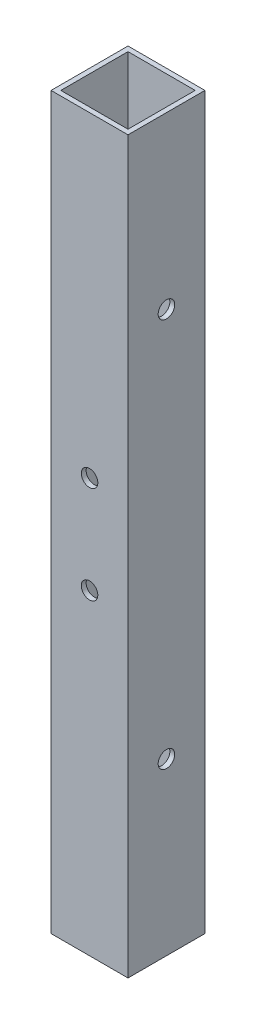
ISO-10303-21;
HEADER;
FILE_DESCRIPTION(('STEP AP214'),'2;1');
FILE_NAME('part.step','',(''),(''),'','','');
FILE_SCHEMA(('AUTOMOTIVE_DESIGN { 1 0 10303 214 1 1 1 1 }'));
ENDSEC;
DATA;
#1=APPLICATION_CONTEXT('core data for automotive mechanical design processes');
#2=APPLICATION_PROTOCOL_DEFINITION('international standard','automotive_design',2000,#1);
#3=PRODUCT_CONTEXT('',#1,'mechanical');
#4=PRODUCT('Part','Part','',(#3));
#5=PRODUCT_RELATED_PRODUCT_CATEGORY('part','',(#4));
#6=PRODUCT_DEFINITION_FORMATION('','',#4);
#7=PRODUCT_DEFINITION_CONTEXT('part definition',#1,'design');
#8=PRODUCT_DEFINITION('design','',#6,#7);
#9=PRODUCT_DEFINITION_SHAPE('','',#8);
#10=(LENGTH_UNIT() NAMED_UNIT(*) SI_UNIT(.MILLI.,.METRE.));
#11=(NAMED_UNIT(*) PLANE_ANGLE_UNIT() SI_UNIT($,.RADIAN.));
#12=(NAMED_UNIT(*) SI_UNIT($,.STERADIAN.) SOLID_ANGLE_UNIT());
#13=UNCERTAINTY_MEASURE_WITH_UNIT(LENGTH_MEASURE(1.E-05),#10,'distance_accuracy_value','');
#14=(GEOMETRIC_REPRESENTATION_CONTEXT(3) GLOBAL_UNCERTAINTY_ASSIGNED_CONTEXT((#13)) GLOBAL_UNIT_ASSIGNED_CONTEXT((#10,
#11,#12)) REPRESENTATION_CONTEXT('',''));
#15=CARTESIAN_POINT('',(0.,0.,0.));
#16=DIRECTION('',(0.,0.,1.));
#17=DIRECTION('',(1.,0.,0.));
#18=AXIS2_PLACEMENT_3D('',#15,#16,#17);
#19=CARTESIAN_POINT('',(0.,150.,0.));
#20=DIRECTION('',(0.,-1.,0.));
#21=DIRECTION('',(0.,0.,-1.));
#22=AXIS2_PLACEMENT_3D('',#19,#20,#21);
#23=PLANE('',#22);
#24=DIRECTION('',(0.,0.,-1.));
#25=VECTOR('',#24,1.);
#26=CARTESIAN_POINT('',(7.9,150.,7.9));
#27=LINE('',#26,#25);
#28=CARTESIAN_POINT('',(7.9,150.,7.9));
#29=VERTEX_POINT('',#28);
#30=CARTESIAN_POINT('',(7.9,150.,-7.9));
#31=VERTEX_POINT('',#30);
#32=EDGE_CURVE('E141',#29,#31,#27,.T.);
#33=ORIENTED_EDGE('',*,*,#32,.T.);
#34=DIRECTION('',(-1.,0.,0.));
#35=VECTOR('',#34,1.);
#36=CARTESIAN_POINT('',(-7.9,150.,-7.9));
#37=LINE('',#36,#35);
#38=CARTESIAN_POINT('',(-7.9,150.,-7.9));
#39=VERTEX_POINT('',#38);
#40=EDGE_CURVE('E144',#31,#39,#37,.T.);
#41=ORIENTED_EDGE('',*,*,#40,.T.);
#42=DIRECTION('',(0.,0.,1.));
#43=VECTOR('',#42,1.);
#44=CARTESIAN_POINT('',(-7.9,150.,7.9));
#45=LINE('',#44,#43);
#46=CARTESIAN_POINT('',(-7.9,150.,7.9));
#47=VERTEX_POINT('',#46);
#48=EDGE_CURVE('E147',#39,#47,#45,.T.);
#49=ORIENTED_EDGE('',*,*,#48,.T.);
#50=DIRECTION('',(1.,0.,0.));
#51=VECTOR('',#50,1.);
#52=CARTESIAN_POINT('',(-7.9,150.,7.9));
#53=LINE('',#52,#51);
#54=EDGE_CURVE('E149',#47,#29,#53,.T.);
#55=ORIENTED_EDGE('',*,*,#54,.T.);
#56=EDGE_LOOP('',(#33,#41,#49,#55));
#57=FACE_BOUND('',#56,.T.);
#58=DIRECTION('',(1.,0.,0.));
#59=VECTOR('',#58,1.);
#60=CARTESIAN_POINT('',(-6.9,150.,6.9));
#61=LINE('',#60,#59);
#62=CARTESIAN_POINT('',(-6.9,150.,6.9));
#63=VERTEX_POINT('',#62);
#64=CARTESIAN_POINT('',(6.9,150.,6.9));
#65=VERTEX_POINT('',#64);
#66=EDGE_CURVE('E103',#63,#65,#61,.T.);
#67=ORIENTED_EDGE('',*,*,#66,.F.);
#68=DIRECTION('',(0.,0.,1.));
#69=VECTOR('',#68,1.);
#70=CARTESIAN_POINT('',(-6.9,150.,6.9));
#71=LINE('',#70,#69);
#72=CARTESIAN_POINT('',(-6.9,150.,-6.9));
#73=VERTEX_POINT('',#72);
#74=EDGE_CURVE('E125',#73,#63,#71,.T.);
#75=ORIENTED_EDGE('',*,*,#74,.F.);
#76=DIRECTION('',(-1.,0.,0.));
#77=VECTOR('',#76,1.);
#78=CARTESIAN_POINT('',(-6.9,150.,-6.9));
#79=LINE('',#78,#77);
#80=CARTESIAN_POINT('',(6.9,150.,-6.9));
#81=VERTEX_POINT('',#80);
#82=EDGE_CURVE('E123',#81,#73,#79,.T.);
#83=ORIENTED_EDGE('',*,*,#82,.F.);
#84=DIRECTION('',(0.,0.,-1.));
#85=VECTOR('',#84,1.);
#86=CARTESIAN_POINT('',(6.9,150.,6.9));
#87=LINE('',#86,#85);
#88=EDGE_CURVE('E111',#65,#81,#87,.T.);
#89=ORIENTED_EDGE('',*,*,#88,.F.);
#90=EDGE_LOOP('',(#67,#75,#83,#89));
#91=FACE_BOUND('',#90,.T.);
#92=ADVANCED_FACE('F36',(#57,#91),#23,.F.);
#93=CARTESIAN_POINT('',(0.,0.,0.));
#94=DIRECTION('',(0.,-1.,0.));
#95=DIRECTION('',(0.,0.,-1.));
#96=AXIS2_PLACEMENT_3D('',#93,#94,#95);
#97=PLANE('',#96);
#98=DIRECTION('',(0.,0.,-1.));
#99=VECTOR('',#98,1.);
#100=CARTESIAN_POINT('',(7.9,0.,7.9));
#101=LINE('',#100,#99);
#102=CARTESIAN_POINT('',(7.9,0.,7.9));
#103=VERTEX_POINT('',#102);
#104=CARTESIAN_POINT('',(7.9,0.,-7.9));
#105=VERTEX_POINT('',#104);
#106=EDGE_CURVE('E119',#103,#105,#101,.T.);
#107=ORIENTED_EDGE('',*,*,#106,.F.);
#108=DIRECTION('',(1.,0.,0.));
#109=VECTOR('',#108,1.);
#110=CARTESIAN_POINT('',(-7.9,0.,7.9));
#111=LINE('',#110,#109);
#112=CARTESIAN_POINT('',(-7.9,0.,7.9));
#113=VERTEX_POINT('',#112);
#114=EDGE_CURVE('E145',#113,#103,#111,.T.);
#115=ORIENTED_EDGE('',*,*,#114,.F.);
#116=DIRECTION('',(0.,0.,1.));
#117=VECTOR('',#116,1.);
#118=CARTESIAN_POINT('',(-7.9,0.,7.9));
#119=LINE('',#118,#117);
#120=CARTESIAN_POINT('',(-7.9,0.,-7.9));
#121=VERTEX_POINT('',#120);
#122=EDGE_CURVE('E156',#121,#113,#119,.T.);
#123=ORIENTED_EDGE('',*,*,#122,.F.);
#124=DIRECTION('',(-1.,0.,0.));
#125=VECTOR('',#124,1.);
#126=CARTESIAN_POINT('',(-7.9,0.,-7.9));
#127=LINE('',#126,#125);
#128=EDGE_CURVE('E154',#105,#121,#127,.T.);
#129=ORIENTED_EDGE('',*,*,#128,.F.);
#130=EDGE_LOOP('',(#107,#115,#123,#129));
#131=FACE_BOUND('',#130,.T.);
#132=DIRECTION('',(0.,0.,1.));
#133=VECTOR('',#132,1.);
#134=CARTESIAN_POINT('',(-6.9,0.,6.9));
#135=LINE('',#134,#133);
#136=CARTESIAN_POINT('',(-6.9,0.,-6.9));
#137=VERTEX_POINT('',#136);
#138=CARTESIAN_POINT('',(-6.9,0.,6.9));
#139=VERTEX_POINT('',#138);
#140=EDGE_CURVE('E112',#137,#139,#135,.T.);
#141=ORIENTED_EDGE('',*,*,#140,.T.);
#142=DIRECTION('',(1.,0.,0.));
#143=VECTOR('',#142,1.);
#144=CARTESIAN_POINT('',(-6.9,0.,6.9));
#145=LINE('',#144,#143);
#146=CARTESIAN_POINT('',(6.9,0.,6.9));
#147=VERTEX_POINT('',#146);
#148=EDGE_CURVE('E61',#139,#147,#145,.T.);
#149=ORIENTED_EDGE('',*,*,#148,.T.);
#150=DIRECTION('',(0.,0.,-1.));
#151=VECTOR('',#150,1.);
#152=CARTESIAN_POINT('',(6.9,0.,6.9));
#153=LINE('',#152,#151);
#154=CARTESIAN_POINT('',(6.9,0.,-6.9));
#155=VERTEX_POINT('',#154);
#156=EDGE_CURVE('E118',#147,#155,#153,.T.);
#157=ORIENTED_EDGE('',*,*,#156,.T.);
#158=DIRECTION('',(-1.,0.,0.));
#159=VECTOR('',#158,1.);
#160=CARTESIAN_POINT('',(-6.9,0.,-6.9));
#161=LINE('',#160,#159);
#162=EDGE_CURVE('E133',#155,#137,#161,.T.);
#163=ORIENTED_EDGE('',*,*,#162,.T.);
#164=EDGE_LOOP('',(#141,#149,#157,#163));
#165=FACE_BOUND('',#164,.T.);
#166=ADVANCED_FACE('F233',(#131,#165),#97,.T.);
#167=CARTESIAN_POINT('',(7.9,150.,7.9));
#168=DIRECTION('',(-1.,0.,0.));
#169=DIRECTION('',(0.,0.,1.));
#170=AXIS2_PLACEMENT_3D('',#167,#168,#169);
#171=PLANE('',#170);
#172=CARTESIAN_POINT('',(7.9,115.,0.));
#173=DIRECTION('',(-1.,0.,0.));
#174=DIRECTION('',(0.,0.,1.));
#175=AXIS2_PLACEMENT_3D('',#172,#173,#174);
#176=CIRCLE('',#175,1.70000000000001);
#177=CARTESIAN_POINT('',(7.9,115.,1.7));
#178=VERTEX_POINT('',#177);
#179=EDGE_CURVE('E170',#178,#178,#176,.T.);
#180=ORIENTED_EDGE('',*,*,#179,.T.);
#181=EDGE_LOOP('',(#180));
#182=FACE_BOUND('',#181,.T.);
#183=CARTESIAN_POINT('',(7.9,35.,0.));
#184=DIRECTION('',(-1.,0.,0.));
#185=DIRECTION('',(0.,0.,-1.));
#186=AXIS2_PLACEMENT_3D('',#183,#184,#185);
#187=CIRCLE('',#186,1.70000000000001);
#188=CARTESIAN_POINT('',(7.9,35.,-1.70000000000001));
#189=VERTEX_POINT('',#188);
#190=EDGE_CURVE('E198',#189,#189,#187,.T.);
#191=ORIENTED_EDGE('',*,*,#190,.T.);
#192=EDGE_LOOP('',(#191));
#193=FACE_BOUND('',#192,.T.);
#194=ORIENTED_EDGE('',*,*,#106,.T.);
#195=DIRECTION('',(0.,-1.,0.));
#196=VECTOR('',#195,1.);
#197=CARTESIAN_POINT('',(7.9,150.,-7.9));
#198=LINE('',#197,#196);
#199=EDGE_CURVE('E11',#31,#105,#198,.T.);
#200=ORIENTED_EDGE('',*,*,#199,.F.);
#201=ORIENTED_EDGE('',*,*,#32,.F.);
#202=DIRECTION('',(0.,-1.,0.));
#203=VECTOR('',#202,1.);
#204=CARTESIAN_POINT('',(7.9,150.,7.9));
#205=LINE('',#204,#203);
#206=EDGE_CURVE('E151',#29,#103,#205,.T.);
#207=ORIENTED_EDGE('',*,*,#206,.T.);
#208=EDGE_LOOP('',(#194,#200,#201,#207));
#209=FACE_BOUND('',#208,.T.);
#210=ADVANCED_FACE('F38',(#182,#193,#209),#171,.F.);
#211=CARTESIAN_POINT('',(-7.9,150.,-7.9));
#212=DIRECTION('',(0.,0.,1.));
#213=DIRECTION('',(1.,0.,0.));
#214=AXIS2_PLACEMENT_3D('',#211,#212,#213);
#215=PLANE('',#214);
#216=CARTESIAN_POINT('',(0.,85.,-7.9));
#217=DIRECTION('',(0.,0.,1.));
#218=DIRECTION('',(1.,0.,0.));
#219=AXIS2_PLACEMENT_3D('',#216,#217,#218);
#220=CIRCLE('',#219,1.7);
#221=CARTESIAN_POINT('',(1.7,85.,-7.9));
#222=VERTEX_POINT('',#221);
#223=EDGE_CURVE('E176',#222,#222,#220,.T.);
#224=ORIENTED_EDGE('',*,*,#223,.T.);
#225=EDGE_LOOP('',(#224));
#226=FACE_BOUND('',#225,.T.);
#227=CARTESIAN_POINT('',(0.,65.,-7.9));
#228=DIRECTION('',(0.,0.,1.));
#229=DIRECTION('',(-1.,0.,0.));
#230=AXIS2_PLACEMENT_3D('',#227,#228,#229);
#231=CIRCLE('',#230,1.7);
#232=CARTESIAN_POINT('',(-1.7,65.,-7.9));
#233=VERTEX_POINT('',#232);
#234=EDGE_CURVE('E192',#233,#233,#231,.T.);
#235=ORIENTED_EDGE('',*,*,#234,.T.);
#236=EDGE_LOOP('',(#235));
#237=FACE_BOUND('',#236,.T.);
#238=ORIENTED_EDGE('',*,*,#128,.T.);
#239=DIRECTION('',(0.,-1.,0.));
#240=VECTOR('',#239,1.);
#241=CARTESIAN_POINT('',(-7.9,150.,-7.9));
#242=LINE('',#241,#240);
#243=EDGE_CURVE('E45',#39,#121,#242,.T.);
#244=ORIENTED_EDGE('',*,*,#243,.F.);
#245=ORIENTED_EDGE('',*,*,#40,.F.);
#246=ORIENTED_EDGE('',*,*,#199,.T.);
#247=EDGE_LOOP('',(#238,#244,#245,#246));
#248=FACE_BOUND('',#247,.T.);
#249=ADVANCED_FACE('F232',(#226,#237,#248),#215,.F.);
#250=CARTESIAN_POINT('',(-7.9,150.,7.9));
#251=DIRECTION('',(1.,0.,0.));
#252=DIRECTION('',(0.,0.,-1.));
#253=AXIS2_PLACEMENT_3D('',#250,#251,#252);
#254=PLANE('',#253);
#255=CARTESIAN_POINT('',(-7.9,115.,0.));
#256=DIRECTION('',(-1.,0.,0.));
#257=DIRECTION('',(0.,0.,1.));
#258=AXIS2_PLACEMENT_3D('',#255,#256,#257);
#259=CIRCLE('',#258,1.70000000000001);
#260=CARTESIAN_POINT('',(-7.9,115.,1.7));
#261=VERTEX_POINT('',#260);
#262=EDGE_CURVE('E201',#261,#261,#259,.T.);
#263=ORIENTED_EDGE('',*,*,#262,.F.);
#264=EDGE_LOOP('',(#263));
#265=FACE_BOUND('',#264,.T.);
#266=CARTESIAN_POINT('',(-7.9,35.,0.));
#267=DIRECTION('',(-1.,0.,0.));
#268=DIRECTION('',(0.,0.,-1.));
#269=AXIS2_PLACEMENT_3D('',#266,#267,#268);
#270=CIRCLE('',#269,1.70000000000001);
#271=CARTESIAN_POINT('',(-7.9,35.,-1.70000000000001));
#272=VERTEX_POINT('',#271);
#273=EDGE_CURVE('E204',#272,#272,#270,.T.);
#274=ORIENTED_EDGE('',*,*,#273,.F.);
#275=EDGE_LOOP('',(#274));
#276=FACE_BOUND('',#275,.T.);
#277=ORIENTED_EDGE('',*,*,#122,.T.);
#278=DIRECTION('',(0.,-1.,0.));
#279=VECTOR('',#278,1.);
#280=CARTESIAN_POINT('',(-7.9,150.,7.9));
#281=LINE('',#280,#279);
#282=EDGE_CURVE('E161',#47,#113,#281,.T.);
#283=ORIENTED_EDGE('',*,*,#282,.F.);
#284=ORIENTED_EDGE('',*,*,#48,.F.);
#285=ORIENTED_EDGE('',*,*,#243,.T.);
#286=EDGE_LOOP('',(#277,#283,#284,#285));
#287=FACE_BOUND('',#286,.T.);
#288=ADVANCED_FACE('F252',(#265,#276,#287),#254,.F.);
#289=CARTESIAN_POINT('',(-7.9,150.,7.9));
#290=DIRECTION('',(0.,0.,-1.));
#291=DIRECTION('',(-1.,0.,0.));
#292=AXIS2_PLACEMENT_3D('',#289,#290,#291);
#293=PLANE('',#292);
#294=CARTESIAN_POINT('',(0.,85.,7.9));
#295=DIRECTION('',(0.,0.,1.));
#296=DIRECTION('',(1.,0.,0.));
#297=AXIS2_PLACEMENT_3D('',#294,#295,#296);
#298=CIRCLE('',#297,1.7);
#299=CARTESIAN_POINT('',(1.7,85.,7.9));
#300=VERTEX_POINT('',#299);
#301=EDGE_CURVE('E182',#300,#300,#298,.T.);
#302=ORIENTED_EDGE('',*,*,#301,.F.);
#303=EDGE_LOOP('',(#302));
#304=FACE_BOUND('',#303,.T.);
#305=CARTESIAN_POINT('',(0.,65.,7.9));
#306=DIRECTION('',(0.,0.,1.));
#307=DIRECTION('',(-1.,0.,0.));
#308=AXIS2_PLACEMENT_3D('',#305,#306,#307);
#309=CIRCLE('',#308,1.7);
#310=CARTESIAN_POINT('',(-1.7,65.,7.9));
#311=VERTEX_POINT('',#310);
#312=EDGE_CURVE('E187',#311,#311,#309,.T.);
#313=ORIENTED_EDGE('',*,*,#312,.F.);
#314=EDGE_LOOP('',(#313));
#315=FACE_BOUND('',#314,.T.);
#316=ORIENTED_EDGE('',*,*,#114,.T.);
#317=ORIENTED_EDGE('',*,*,#206,.F.);
#318=ORIENTED_EDGE('',*,*,#54,.F.);
#319=ORIENTED_EDGE('',*,*,#282,.T.);
#320=EDGE_LOOP('',(#316,#317,#318,#319));
#321=FACE_BOUND('',#320,.T.);
#322=ADVANCED_FACE('F250',(#304,#315,#321),#293,.F.);
#323=CARTESIAN_POINT('',(-6.9,150.,6.9));
#324=DIRECTION('',(0.,0.,-1.));
#325=DIRECTION('',(-1.,0.,0.));
#326=AXIS2_PLACEMENT_3D('',#323,#324,#325);
#327=PLANE('',#326);
#328=CARTESIAN_POINT('',(0.,85.,6.9));
#329=DIRECTION('',(0.,0.,-1.));
#330=DIRECTION('',(-1.,0.,0.));
#331=AXIS2_PLACEMENT_3D('',#328,#329,#330);
#332=CIRCLE('',#331,1.7);
#333=CARTESIAN_POINT('',(-1.7,85.,6.9));
#334=VERTEX_POINT('',#333);
#335=EDGE_CURVE('E195',#334,#334,#332,.T.);
#336=ORIENTED_EDGE('',*,*,#335,.F.);
#337=EDGE_LOOP('',(#336));
#338=FACE_BOUND('',#337,.T.);
#339=CARTESIAN_POINT('',(0.,65.,6.9));
#340=DIRECTION('',(0.,0.,-1.));
#341=DIRECTION('',(-1.,0.,0.));
#342=AXIS2_PLACEMENT_3D('',#339,#340,#341);
#343=CIRCLE('',#342,1.7);
#344=CARTESIAN_POINT('',(-1.7,65.,6.9));
#345=VERTEX_POINT('',#344);
#346=EDGE_CURVE('E175',#345,#345,#343,.T.);
#347=ORIENTED_EDGE('',*,*,#346,.F.);
#348=EDGE_LOOP('',(#347));
#349=FACE_BOUND('',#348,.T.);
#350=ORIENTED_EDGE('',*,*,#148,.F.);
#351=DIRECTION('',(0.,-1.,0.));
#352=VECTOR('',#351,1.);
#353=CARTESIAN_POINT('',(-6.9,150.,6.9));
#354=LINE('',#353,#352);
#355=EDGE_CURVE('E107',#63,#139,#354,.T.);
#356=ORIENTED_EDGE('',*,*,#355,.F.);
#357=ORIENTED_EDGE('',*,*,#66,.T.);
#358=DIRECTION('',(0.,-1.,0.));
#359=VECTOR('',#358,1.);
#360=CARTESIAN_POINT('',(6.9,150.,6.9));
#361=LINE('',#360,#359);
#362=EDGE_CURVE('E106',#65,#147,#361,.T.);
#363=ORIENTED_EDGE('',*,*,#362,.T.);
#364=EDGE_LOOP('',(#350,#356,#357,#363));
#365=FACE_BOUND('',#364,.T.);
#366=ADVANCED_FACE('F105',(#338,#349,#365),#327,.T.);
#367=CARTESIAN_POINT('',(6.9,150.,6.9));
#368=DIRECTION('',(-1.,0.,0.));
#369=DIRECTION('',(0.,0.,1.));
#370=AXIS2_PLACEMENT_3D('',#367,#368,#369);
#371=PLANE('',#370);
#372=CARTESIAN_POINT('',(6.9,115.,0.));
#373=DIRECTION('',(-1.,0.,0.));
#374=DIRECTION('',(0.,0.,1.));
#375=AXIS2_PLACEMENT_3D('',#372,#373,#374);
#376=CIRCLE('',#375,1.70000000000001);
#377=CARTESIAN_POINT('',(6.9,115.,1.7));
#378=VERTEX_POINT('',#377);
#379=EDGE_CURVE('E131',#378,#378,#376,.T.);
#380=ORIENTED_EDGE('',*,*,#379,.F.);
#381=EDGE_LOOP('',(#380));
#382=FACE_BOUND('',#381,.T.);
#383=CARTESIAN_POINT('',(6.9,35.,0.));
#384=DIRECTION('',(-1.,0.,0.));
#385=DIRECTION('',(0.,0.,1.));
#386=AXIS2_PLACEMENT_3D('',#383,#384,#385);
#387=CIRCLE('',#386,1.70000000000001);
#388=CARTESIAN_POINT('',(6.9,35.,1.70000000000001));
#389=VERTEX_POINT('',#388);
#390=EDGE_CURVE('E169',#389,#389,#387,.T.);
#391=ORIENTED_EDGE('',*,*,#390,.F.);
#392=EDGE_LOOP('',(#391));
#393=FACE_BOUND('',#392,.T.);
#394=ORIENTED_EDGE('',*,*,#156,.F.);
#395=ORIENTED_EDGE('',*,*,#362,.F.);
#396=ORIENTED_EDGE('',*,*,#88,.T.);
#397=DIRECTION('',(0.,-1.,0.));
#398=VECTOR('',#397,1.);
#399=CARTESIAN_POINT('',(6.9,150.,-6.9));
#400=LINE('',#399,#398);
#401=EDGE_CURVE('E120',#81,#155,#400,.T.);
#402=ORIENTED_EDGE('',*,*,#401,.T.);
#403=EDGE_LOOP('',(#394,#395,#396,#402));
#404=FACE_BOUND('',#403,.T.);
#405=ADVANCED_FACE('F115',(#382,#393,#404),#371,.T.);
#406=CARTESIAN_POINT('',(-6.9,150.,-6.9));
#407=DIRECTION('',(0.,0.,1.));
#408=DIRECTION('',(1.,0.,0.));
#409=AXIS2_PLACEMENT_3D('',#406,#407,#408);
#410=PLANE('',#409);
#411=CARTESIAN_POINT('',(0.,85.,-6.9));
#412=DIRECTION('',(0.,0.,1.));
#413=DIRECTION('',(1.,0.,0.));
#414=AXIS2_PLACEMENT_3D('',#411,#412,#413);
#415=CIRCLE('',#414,1.7);
#416=CARTESIAN_POINT('',(1.7,85.,-6.9));
#417=VERTEX_POINT('',#416);
#418=EDGE_CURVE('E40',#417,#417,#415,.T.);
#419=ORIENTED_EDGE('',*,*,#418,.F.);
#420=EDGE_LOOP('',(#419));
#421=FACE_BOUND('',#420,.T.);
#422=CARTESIAN_POINT('',(0.,65.,-6.9));
#423=DIRECTION('',(0.,0.,1.));
#424=DIRECTION('',(1.,0.,0.));
#425=AXIS2_PLACEMENT_3D('',#422,#423,#424);
#426=CIRCLE('',#425,1.7);
#427=CARTESIAN_POINT('',(1.7,65.,-6.9));
#428=VERTEX_POINT('',#427);
#429=EDGE_CURVE('E173',#428,#428,#426,.T.);
#430=ORIENTED_EDGE('',*,*,#429,.F.);
#431=EDGE_LOOP('',(#430));
#432=FACE_BOUND('',#431,.T.);
#433=ORIENTED_EDGE('',*,*,#162,.F.);
#434=ORIENTED_EDGE('',*,*,#401,.F.);
#435=ORIENTED_EDGE('',*,*,#82,.T.);
#436=DIRECTION('',(0.,-1.,0.));
#437=VECTOR('',#436,1.);
#438=CARTESIAN_POINT('',(-6.9,150.,-6.9));
#439=LINE('',#438,#437);
#440=EDGE_CURVE('E53',#73,#137,#439,.T.);
#441=ORIENTED_EDGE('',*,*,#440,.T.);
#442=EDGE_LOOP('',(#433,#434,#435,#441));
#443=FACE_BOUND('',#442,.T.);
#444=ADVANCED_FACE('F218',(#421,#432,#443),#410,.T.);
#445=CARTESIAN_POINT('',(-6.9,150.,6.9));
#446=DIRECTION('',(1.,0.,0.));
#447=DIRECTION('',(0.,0.,-1.));
#448=AXIS2_PLACEMENT_3D('',#445,#446,#447);
#449=PLANE('',#448);
#450=CARTESIAN_POINT('',(-6.9,115.,0.));
#451=DIRECTION('',(1.,0.,0.));
#452=DIRECTION('',(0.,0.,-1.));
#453=AXIS2_PLACEMENT_3D('',#450,#451,#452);
#454=CIRCLE('',#453,1.70000000000001);
#455=CARTESIAN_POINT('',(-6.9,115.,-1.70000000000002));
#456=VERTEX_POINT('',#455);
#457=EDGE_CURVE('E171',#456,#456,#454,.T.);
#458=ORIENTED_EDGE('',*,*,#457,.F.);
#459=EDGE_LOOP('',(#458));
#460=FACE_BOUND('',#459,.T.);
#461=CARTESIAN_POINT('',(-6.9,35.,0.));
#462=DIRECTION('',(1.,0.,0.));
#463=DIRECTION('',(0.,0.,-1.));
#464=AXIS2_PLACEMENT_3D('',#461,#462,#463);
#465=CIRCLE('',#464,1.70000000000001);
#466=CARTESIAN_POINT('',(-6.9,35.,-1.70000000000001));
#467=VERTEX_POINT('',#466);
#468=EDGE_CURVE('E166',#467,#467,#465,.T.);
#469=ORIENTED_EDGE('',*,*,#468,.F.);
#470=EDGE_LOOP('',(#469));
#471=FACE_BOUND('',#470,.T.);
#472=ORIENTED_EDGE('',*,*,#140,.F.);
#473=ORIENTED_EDGE('',*,*,#440,.F.);
#474=ORIENTED_EDGE('',*,*,#74,.T.);
#475=ORIENTED_EDGE('',*,*,#355,.T.);
#476=EDGE_LOOP('',(#472,#473,#474,#475));
#477=FACE_BOUND('',#476,.T.);
#478=ADVANCED_FACE('F276',(#460,#471,#477),#449,.T.);
#479=CARTESIAN_POINT('',(7.9,35.,0.));
#480=DIRECTION('',(-1.,0.,0.));
#481=DIRECTION('',(0.,0.,1.));
#482=AXIS2_PLACEMENT_3D('',#479,#480,#481);
#483=CYLINDRICAL_SURFACE('',#482,1.70000000000001);
#484=ORIENTED_EDGE('',*,*,#468,.T.);
#485=EDGE_LOOP('',(#484));
#486=FACE_BOUND('',#485,.T.);
#487=ORIENTED_EDGE('',*,*,#273,.T.);
#488=EDGE_LOOP('',(#487));
#489=FACE_BOUND('',#488,.T.);
#490=ADVANCED_FACE('F227',(#486,#489),#483,.F.);
#491=CARTESIAN_POINT('',(7.9,115.,0.));
#492=DIRECTION('',(-1.,0.,0.));
#493=DIRECTION('',(0.,0.,1.));
#494=AXIS2_PLACEMENT_3D('',#491,#492,#493);
#495=CYLINDRICAL_SURFACE('',#494,1.70000000000001);
#496=ORIENTED_EDGE('',*,*,#457,.T.);
#497=EDGE_LOOP('',(#496));
#498=FACE_BOUND('',#497,.T.);
#499=ORIENTED_EDGE('',*,*,#262,.T.);
#500=EDGE_LOOP('',(#499));
#501=FACE_BOUND('',#500,.T.);
#502=ADVANCED_FACE('F225',(#498,#501),#495,.F.);
#503=ORIENTED_EDGE('',*,*,#390,.T.);
#504=EDGE_LOOP('',(#503));
#505=FACE_BOUND('',#504,.T.);
#506=ORIENTED_EDGE('',*,*,#190,.F.);
#507=EDGE_LOOP('',(#506));
#508=FACE_BOUND('',#507,.T.);
#509=ADVANCED_FACE('F222',(#505,#508),#483,.F.);
#510=ORIENTED_EDGE('',*,*,#379,.T.);
#511=EDGE_LOOP('',(#510));
#512=FACE_BOUND('',#511,.T.);
#513=ORIENTED_EDGE('',*,*,#179,.F.);
#514=EDGE_LOOP('',(#513));
#515=FACE_BOUND('',#514,.T.);
#516=ADVANCED_FACE('F213',(#512,#515),#495,.F.);
#517=CARTESIAN_POINT('',(0.,65.,-7.9));
#518=DIRECTION('',(0.,0.,1.));
#519=DIRECTION('',(1.,0.,0.));
#520=AXIS2_PLACEMENT_3D('',#517,#518,#519);
#521=CYLINDRICAL_SURFACE('',#520,1.7);
#522=ORIENTED_EDGE('',*,*,#429,.T.);
#523=EDGE_LOOP('',(#522));
#524=FACE_BOUND('',#523,.T.);
#525=ORIENTED_EDGE('',*,*,#234,.F.);
#526=EDGE_LOOP('',(#525));
#527=FACE_BOUND('',#526,.T.);
#528=ADVANCED_FACE('F286',(#524,#527),#521,.F.);
#529=CARTESIAN_POINT('',(0.,85.,-7.9));
#530=DIRECTION('',(0.,0.,1.));
#531=DIRECTION('',(1.,0.,0.));
#532=AXIS2_PLACEMENT_3D('',#529,#530,#531);
#533=CYLINDRICAL_SURFACE('',#532,1.7);
#534=ORIENTED_EDGE('',*,*,#418,.T.);
#535=EDGE_LOOP('',(#534));
#536=FACE_BOUND('',#535,.T.);
#537=ORIENTED_EDGE('',*,*,#223,.F.);
#538=EDGE_LOOP('',(#537));
#539=FACE_BOUND('',#538,.T.);
#540=ADVANCED_FACE('F289',(#536,#539),#533,.F.);
#541=ORIENTED_EDGE('',*,*,#346,.T.);
#542=EDGE_LOOP('',(#541));
#543=FACE_BOUND('',#542,.T.);
#544=ORIENTED_EDGE('',*,*,#312,.T.);
#545=EDGE_LOOP('',(#544));
#546=FACE_BOUND('',#545,.T.);
#547=ADVANCED_FACE('F290',(#543,#546),#521,.F.);
#548=ORIENTED_EDGE('',*,*,#335,.T.);
#549=EDGE_LOOP('',(#548));
#550=FACE_BOUND('',#549,.T.);
#551=ORIENTED_EDGE('',*,*,#301,.T.);
#552=EDGE_LOOP('',(#551));
#553=FACE_BOUND('',#552,.T.);
#554=ADVANCED_FACE('F293',(#550,#553),#533,.F.);
#555=CLOSED_SHELL('',(#92,#166,#210,#249,#288,#322,#366,#405,#444,#478,#490,#502,#509,#516,#528,
#540,#547,#554));
#556=MANIFOLD_SOLID_BREP('B2',#555);
#557=ADVANCED_BREP_SHAPE_REPRESENTATION('',(#18,#556),#14);
#558=SHAPE_DEFINITION_REPRESENTATION(#9,#557);
ENDSEC;
END-ISO-10303-21;
